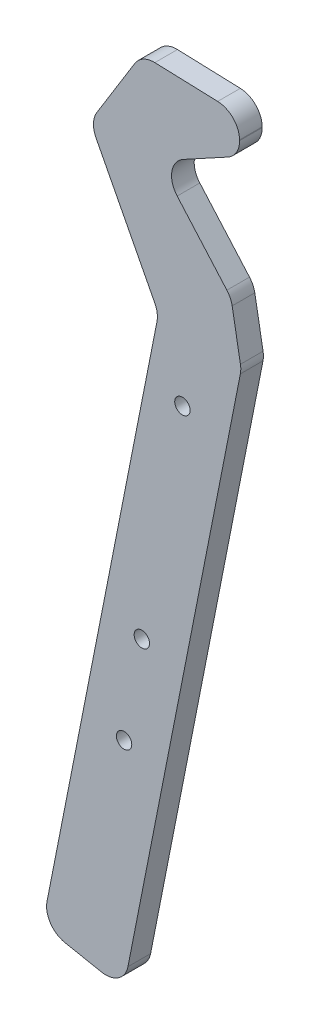
ISO-10303-21;
HEADER;
FILE_DESCRIPTION(('STEP AP214'),'2;1');
FILE_NAME('part.step','',(''),(''),'','','');
FILE_SCHEMA(('AUTOMOTIVE_DESIGN { 1 0 10303 214 1 1 1 1 }'));
ENDSEC;
DATA;
#1=APPLICATION_CONTEXT('core data for automotive mechanical design processes');
#2=APPLICATION_PROTOCOL_DEFINITION('international standard','automotive_design',2000,#1);
#3=PRODUCT_CONTEXT('',#1,'mechanical');
#4=PRODUCT('Part','Part','',(#3));
#5=PRODUCT_RELATED_PRODUCT_CATEGORY('part','',(#4));
#6=PRODUCT_DEFINITION_FORMATION('','',#4);
#7=PRODUCT_DEFINITION_CONTEXT('part definition',#1,'design');
#8=PRODUCT_DEFINITION('design','',#6,#7);
#9=PRODUCT_DEFINITION_SHAPE('','',#8);
#10=(LENGTH_UNIT() NAMED_UNIT(*) SI_UNIT(.MILLI.,.METRE.));
#11=(NAMED_UNIT(*) PLANE_ANGLE_UNIT() SI_UNIT($,.RADIAN.));
#12=(NAMED_UNIT(*) SI_UNIT($,.STERADIAN.) SOLID_ANGLE_UNIT());
#13=UNCERTAINTY_MEASURE_WITH_UNIT(LENGTH_MEASURE(1.E-05),#10,'distance_accuracy_value','');
#14=(GEOMETRIC_REPRESENTATION_CONTEXT(3) GLOBAL_UNCERTAINTY_ASSIGNED_CONTEXT((#13)) GLOBAL_UNIT_ASSIGNED_CONTEXT((#10,
#11,#12)) REPRESENTATION_CONTEXT('',''));
#15=CARTESIAN_POINT('',(0.,0.,0.));
#16=DIRECTION('',(0.,0.,1.));
#17=DIRECTION('',(1.,0.,0.));
#18=AXIS2_PLACEMENT_3D('',#15,#16,#17);
#19=CARTESIAN_POINT('',(-38.8665019834913,-148.048845345949,5.));
#20=DIRECTION('',(0.,0.,1.));
#21=DIRECTION('',(1.,0.,0.));
#22=AXIS2_PLACEMENT_3D('',#19,#20,#21);
#23=PLANE('',#22);
#24=CARTESIAN_POINT('',(-26.7484625073589,-107.729710297534,5.));
#25=DIRECTION('',(0.,0.,1.));
#26=DIRECTION('',(1.,0.,0.));
#27=AXIS2_PLACEMENT_3D('',#24,#25,#26);
#28=CIRCLE('',#27,1.7);
#29=CARTESIAN_POINT('',(-25.0484625073589,-107.729710297534,5.));
#30=VERTEX_POINT('',#29);
#31=EDGE_CURVE('E391',#30,#30,#28,.T.);
#32=ORIENTED_EDGE('',*,*,#31,.F.);
#33=EDGE_LOOP('',(#32));
#34=FACE_BOUND('',#33,.T.);
#35=CARTESIAN_POINT('',(-38.8665019834913,-148.048845345949,5.));
#36=DIRECTION('',(0.,0.,1.));
#37=DIRECTION('',(1.,0.,0.));
#38=AXIS2_PLACEMENT_3D('',#35,#36,#37);
#39=CIRCLE('',#38,4.99999999999981);
#40=CARTESIAN_POINT('',(-43.771872124873,-147.080680186466,5.));
#41=VERTEX_POINT('',#40);
#42=CARTESIAN_POINT('',(-39.8346671429742,-152.954215487331,5.));
#43=VERTEX_POINT('',#42);
#44=EDGE_CURVE('E241',#41,#43,#39,.T.);
#45=ORIENTED_EDGE('',*,*,#44,.T.);
#46=DIRECTION('',(0.981074028276413,-0.193633031896657,0.));
#47=VECTOR('',#46,1.);
#48=CARTESIAN_POINT('',(-39.8346671429742,-152.954215487331,5.));
#49=LINE('',#48,#47);
#50=CARTESIAN_POINT('',(-31.7663230386822,-154.546651823705,5.));
#51=VERTEX_POINT('',#50);
#52=EDGE_CURVE('E129',#43,#51,#49,.T.);
#53=ORIENTED_EDGE('',*,*,#52,.T.);
#54=CARTESIAN_POINT('',(-30.7981578791992,-149.641281682323,5.));
#55=DIRECTION('',(0.,0.,1.));
#56=DIRECTION('',(1.,0.,0.));
#57=AXIS2_PLACEMENT_3D('',#54,#55,#56);
#58=CIRCLE('',#57,5.00000000000011);
#59=CARTESIAN_POINT('',(-25.8927877378168,-150.609446841806,5.));
#60=VERTEX_POINT('',#59);
#61=EDGE_CURVE('E292',#51,#60,#58,.T.);
#62=ORIENTED_EDGE('',*,*,#61,.T.);
#63=DIRECTION('',(0.193633031896657,0.981074028276413,0.));
#64=VECTOR('',#63,1.);
#65=CARTESIAN_POINT('',(-25.8927877378168,-150.609446841806,5.));
#66=LINE('',#65,#64);
#67=CARTESIAN_POINT('',(-1.06250463973813,-24.8026791448716,5.));
#68=VERTEX_POINT('',#67);
#69=EDGE_CURVE('E311',#60,#68,#66,.T.);
#70=ORIENTED_EDGE('',*,*,#69,.T.);
#71=CARTESIAN_POINT('',(-5.96787478112019,-23.8345139853883,5.));
#72=DIRECTION('',(0.,0.,1.));
#73=DIRECTION('',(1.,0.,0.));
#74=AXIS2_PLACEMENT_3D('',#71,#72,#73);
#75=CIRCLE('',#74,5.);
#76=CARTESIAN_POINT('',(-1.04597709465115,-22.9542167833419,5.));
#77=VERTEX_POINT('',#76);
#78=EDGE_CURVE('E308',#68,#77,#75,.T.);
#79=ORIENTED_EDGE('',*,*,#78,.T.);
#80=DIRECTION('',(-0.176059440409267,0.98437953729381,0.));
#81=VECTOR('',#80,1.);
#82=CARTESIAN_POINT('',(-1.04597709465115,-22.9542167833419,5.));
#83=LINE('',#82,#81);
#84=CARTESIAN_POINT('',(-2.87940644662452,-12.7031883070442,5.));
#85=VERTEX_POINT('',#84);
#86=EDGE_CURVE('E310',#77,#85,#83,.T.);
#87=ORIENTED_EDGE('',*,*,#86,.T.);
#88=CARTESIAN_POINT('',(-7.80130413309358,-13.5834855090905,5.));
#89=DIRECTION('',(0.,0.,1.));
#90=DIRECTION('',(1.,0.,0.));
#91=AXIS2_PLACEMENT_3D('',#88,#89,#90);
#92=CIRCLE('',#91,5.);
#93=CARTESIAN_POINT('',(-4.04259850302367,-10.2861938952837,5.));
#94=VERTEX_POINT('',#93);
#95=EDGE_CURVE('E313',#85,#94,#92,.T.);
#96=ORIENTED_EDGE('',*,*,#95,.T.);
#97=DIRECTION('',(-0.65945832276136,0.751741126013985,0.));
#98=VECTOR('',#97,1.);
#99=CARTESIAN_POINT('',(-4.04259850302367,-10.2861938952837,5.));
#100=LINE('',#99,#98);
#101=CARTESIAN_POINT('',(-15.0241596749681,2.23209706542699,5.));
#102=VERTEX_POINT('',#101);
#103=EDGE_CURVE('E319',#94,#102,#100,.T.);
#104=ORIENTED_EDGE('',*,*,#103,.T.);
#105=CARTESIAN_POINT('',(-11.2654540448982,5.52938867923382,5.));
#106=DIRECTION('',(0.,0.,-1.));
#107=DIRECTION('',(-1.,0.,0.));
#108=AXIS2_PLACEMENT_3D('',#105,#106,#107);
#109=CIRCLE('',#108,5.);
#110=CARTESIAN_POINT('',(-13.6608923176584,9.9182240009787,5.));
#111=VERTEX_POINT('',#110);
#112=EDGE_CURVE('E321',#102,#111,#109,.T.);
#113=ORIENTED_EDGE('',*,*,#112,.T.);
#114=DIRECTION('',(0.877767064348971,0.479087654552056,0.));
#115=VECTOR('',#114,1.);
#116=CARTESIAN_POINT('',(-13.6608923176584,9.9182240009787,5.));
#117=LINE('',#116,#115);
#118=CARTESIAN_POINT('',(-3.84489177546762,15.275823833376,5.));
#119=VERTEX_POINT('',#118);
#120=EDGE_CURVE('E323',#111,#119,#117,.T.);
#121=ORIENTED_EDGE('',*,*,#120,.T.);
#122=CARTESIAN_POINT('',(-6.24033004822788,19.6646591551208,5.));
#123=DIRECTION('',(0.,0.,1.));
#124=DIRECTION('',(1.,0.,0.));
#125=AXIS2_PLACEMENT_3D('',#122,#123,#124);
#126=CIRCLE('',#125,5.);
#127=CARTESIAN_POINT('',(-1.24056117125479,19.712733855861,5.));
#128=VERTEX_POINT('',#127);
#129=EDGE_CURVE('E325',#119,#128,#126,.T.);
#130=ORIENTED_EDGE('',*,*,#129,.T.);
#131=DIRECTION('',(-0.00961494014802506,0.999953775394618,0.));
#132=VECTOR('',#131,1.);
#133=CARTESIAN_POINT('',(-1.24056117125479,19.712733855861,5.));
#134=LINE('',#133,#132);
#135=CARTESIAN_POINT('',(-1.24200830417585,19.8632356796507,5.));
#136=VERTEX_POINT('',#135);
#137=EDGE_CURVE('E327',#128,#136,#134,.T.);
#138=ORIENTED_EDGE('',*,*,#137,.T.);
#139=CARTESIAN_POINT('',(-6.24177718114894,19.8151609789106,5.));
#140=DIRECTION('',(0.,0.,1.));
#141=DIRECTION('',(-1.,0.,0.));
#142=AXIS2_PLACEMENT_3D('',#139,#140,#141);
#143=CIRCLE('',#142,5.);
#144=CARTESIAN_POINT('',(-6.07046418155175,24.812225302708,5.));
#145=VERTEX_POINT('',#144);
#146=EDGE_CURVE('E329',#136,#145,#143,.T.);
#147=ORIENTED_EDGE('',*,*,#146,.T.);
#148=DIRECTION('',(-0.999412864759485,0.0342625999194433,0.));
#149=VECTOR('',#148,1.);
#150=CARTESIAN_POINT('',(-6.07046418155175,24.812225302708,5.));
#151=LINE('',#150,#149);
#152=CARTESIAN_POINT('',(-19.9580713536889,25.2883303691481,5.));
#153=VERTEX_POINT('',#152);
#154=EDGE_CURVE('E331',#145,#153,#151,.T.);
#155=ORIENTED_EDGE('',*,*,#154,.T.);
#156=CARTESIAN_POINT('',(-20.1293843532861,20.2912660453506,5.));
#157=DIRECTION('',(0.,0.,1.));
#158=DIRECTION('',(1.,0.,0.));
#159=AXIS2_PLACEMENT_3D('',#156,#157,#158);
#160=CIRCLE('',#159,5.);
#161=CARTESIAN_POINT('',(-24.3841314689178,22.9175042260997,5.));
#162=VERTEX_POINT('',#161);
#163=EDGE_CURVE('E333',#153,#162,#160,.T.);
#164=ORIENTED_EDGE('',*,*,#163,.T.);
#165=DIRECTION('',(-0.525247636149815,-0.850949423126329,0.));
#166=VECTOR('',#165,1.);
#167=CARTESIAN_POINT('',(-24.3841314689178,22.9175042260997,5.));
#168=LINE('',#167,#166);
#169=CARTESIAN_POINT('',(-32.7676694669625,9.33540250454337,5.));
#170=VERTEX_POINT('',#169);
#171=EDGE_CURVE('E335',#162,#170,#168,.T.);
#172=ORIENTED_EDGE('',*,*,#171,.T.);
#173=CARTESIAN_POINT('',(-28.5129223513309,6.70916432379427,5.));
#174=DIRECTION('',(0.,0.,1.));
#175=DIRECTION('',(1.,0.,0.));
#176=AXIS2_PLACEMENT_3D('',#173,#174,#175);
#177=CIRCLE('',#176,5.);
#178=CARTESIAN_POINT('',(-32.9540105671106,4.41204972942542,5.));
#179=VERTEX_POINT('',#178);
#180=EDGE_CURVE('E184',#170,#179,#177,.T.);
#181=ORIENTED_EDGE('',*,*,#180,.T.);
#182=DIRECTION('',(0.459422918873767,-0.888217643155949,0.));
#183=VECTOR('',#182,1.);
#184=CARTESIAN_POINT('',(-32.9540105671106,4.41204972942542,5.));
#185=LINE('',#184,#183);
#186=CARTESIAN_POINT('',(-19.9447834462074,-20.7391227043207,5.));
#187=VERTEX_POINT('',#186);
#188=EDGE_CURVE('E178',#179,#187,#185,.T.);
#189=ORIENTED_EDGE('',*,*,#188,.T.);
#190=CARTESIAN_POINT('',(-24.3858716619871,-23.0362372986896,5.));
#191=DIRECTION('',(0.,0.,-1.));
#192=DIRECTION('',(-1.,0.,0.));
#193=AXIS2_PLACEMENT_3D('',#190,#191,#192);
#194=CIRCLE('',#193,5.);
#195=CARTESIAN_POINT('',(-19.4805015206051,-24.0044024581729,5.));
#196=VERTEX_POINT('',#195);
#197=EDGE_CURVE('E182',#187,#196,#194,.T.);
#198=ORIENTED_EDGE('',*,*,#197,.T.);
#199=DIRECTION('',(-0.193633031896657,-0.981074028276413,0.));
#200=VECTOR('',#199,1.);
#201=CARTESIAN_POINT('',(-19.4805015206051,-24.0044024581729,5.));
#202=LINE('',#201,#200);
#203=EDGE_CURVE('E50',#196,#41,#202,.T.);
#204=ORIENTED_EDGE('',*,*,#203,.T.);
#205=EDGE_LOOP('',(#45,#53,#62,#70,#79,#87,#96,#104,#113,#121,#130,#138,#147,#155,#164,#172,
#181,#189,#198,#204));
#206=FACE_BOUND('',#205,.T.);
#207=CARTESIAN_POINT('',(-13.8653532473741,-37.3573916506778,5.));
#208=DIRECTION('',(0.,0.,1.));
#209=DIRECTION('',(1.,0.,0.));
#210=AXIS2_PLACEMENT_3D('',#207,#208,#209);
#211=CIRCLE('',#210,1.7);
#212=CARTESIAN_POINT('',(-12.1653532473741,-37.3573916506778,5.));
#213=VERTEX_POINT('',#212);
#214=EDGE_CURVE('E206',#213,#213,#211,.T.);
#215=ORIENTED_EDGE('',*,*,#214,.F.);
#216=EDGE_LOOP('',(#215));
#217=FACE_BOUND('',#216,.T.);
#218=CARTESIAN_POINT('',(-22.8255627593025,-86.4125938985046,5.));
#219=DIRECTION('',(0.,0.,1.));
#220=DIRECTION('',(1.,0.,0.));
#221=AXIS2_PLACEMENT_3D('',#218,#219,#220);
#222=CIRCLE('',#221,1.7);
#223=CARTESIAN_POINT('',(-21.1255627593025,-86.4125938985046,5.));
#224=VERTEX_POINT('',#223);
#225=EDGE_CURVE('E382',#224,#224,#222,.T.);
#226=ORIENTED_EDGE('',*,*,#225,.F.);
#227=EDGE_LOOP('',(#226));
#228=FACE_BOUND('',#227,.T.);
#229=ADVANCED_FACE('F33',(#34,#206,#217,#228),#23,.T.);
#230=CARTESIAN_POINT('',(-38.8665019834913,-148.048845345949,0.));
#231=DIRECTION('',(0.,0.,1.));
#232=DIRECTION('',(1.,0.,0.));
#233=AXIS2_PLACEMENT_3D('',#230,#231,#232);
#234=PLANE('',#233);
#235=CARTESIAN_POINT('',(-26.7484625073589,-107.729710297534,0.));
#236=DIRECTION('',(0.,0.,1.));
#237=DIRECTION('',(1.,0.,0.));
#238=AXIS2_PLACEMENT_3D('',#235,#236,#237);
#239=CIRCLE('',#238,1.7);
#240=CARTESIAN_POINT('',(-25.0484625073589,-107.729710297534,0.));
#241=VERTEX_POINT('',#240);
#242=EDGE_CURVE('E388',#241,#241,#239,.T.);
#243=ORIENTED_EDGE('',*,*,#242,.T.);
#244=EDGE_LOOP('',(#243));
#245=FACE_BOUND('',#244,.T.);
#246=CARTESIAN_POINT('',(-38.8665019834913,-148.048845345949,0.));
#247=DIRECTION('',(0.,0.,1.));
#248=DIRECTION('',(1.,0.,0.));
#249=AXIS2_PLACEMENT_3D('',#246,#247,#248);
#250=CIRCLE('',#249,4.99999999999981);
#251=CARTESIAN_POINT('',(-43.771872124873,-147.080680186466,0.));
#252=VERTEX_POINT('',#251);
#253=CARTESIAN_POINT('',(-39.8346671429742,-152.954215487331,0.));
#254=VERTEX_POINT('',#253);
#255=EDGE_CURVE('E202',#252,#254,#250,.T.);
#256=ORIENTED_EDGE('',*,*,#255,.F.);
#257=DIRECTION('',(-0.193633031896657,-0.981074028276413,0.));
#258=VECTOR('',#257,1.);
#259=CARTESIAN_POINT('',(-19.4805015206051,-24.0044024581729,0.));
#260=LINE('',#259,#258);
#261=CARTESIAN_POINT('',(-19.4805015206051,-24.0044024581729,0.));
#262=VERTEX_POINT('',#261);
#263=EDGE_CURVE('E121',#262,#252,#260,.T.);
#264=ORIENTED_EDGE('',*,*,#263,.F.);
#265=CARTESIAN_POINT('',(-24.3858716619871,-23.0362372986896,0.));
#266=DIRECTION('',(0.,0.,-1.));
#267=DIRECTION('',(-1.,0.,0.));
#268=AXIS2_PLACEMENT_3D('',#265,#266,#267);
#269=CIRCLE('',#268,5.);
#270=CARTESIAN_POINT('',(-19.9447834462074,-20.7391227043207,0.));
#271=VERTEX_POINT('',#270);
#272=EDGE_CURVE('E115',#271,#262,#269,.T.);
#273=ORIENTED_EDGE('',*,*,#272,.F.);
#274=DIRECTION('',(0.459422918873767,-0.888217643155949,0.));
#275=VECTOR('',#274,1.);
#276=CARTESIAN_POINT('',(-32.9540105671106,4.41204972942542,0.));
#277=LINE('',#276,#275);
#278=CARTESIAN_POINT('',(-32.9540105671106,4.41204972942542,0.));
#279=VERTEX_POINT('',#278);
#280=EDGE_CURVE('E192',#279,#271,#277,.T.);
#281=ORIENTED_EDGE('',*,*,#280,.F.);
#282=CARTESIAN_POINT('',(-28.5129223513309,6.70916432379427,0.));
#283=DIRECTION('',(0.,0.,1.));
#284=DIRECTION('',(1.,0.,0.));
#285=AXIS2_PLACEMENT_3D('',#282,#283,#284);
#286=CIRCLE('',#285,5.);
#287=CARTESIAN_POINT('',(-32.7676694669625,9.33540250454337,0.));
#288=VERTEX_POINT('',#287);
#289=EDGE_CURVE('E236',#288,#279,#286,.T.);
#290=ORIENTED_EDGE('',*,*,#289,.F.);
#291=DIRECTION('',(-0.525247636149815,-0.850949423126329,0.));
#292=VECTOR('',#291,1.);
#293=CARTESIAN_POINT('',(-24.3841314689178,22.9175042260997,0.));
#294=LINE('',#293,#292);
#295=CARTESIAN_POINT('',(-24.3841314689178,22.9175042260997,0.));
#296=VERTEX_POINT('',#295);
#297=EDGE_CURVE('E234',#296,#288,#294,.T.);
#298=ORIENTED_EDGE('',*,*,#297,.F.);
#299=CARTESIAN_POINT('',(-20.1293843532861,20.2912660453506,0.));
#300=DIRECTION('',(0.,0.,1.));
#301=DIRECTION('',(1.,0.,0.));
#302=AXIS2_PLACEMENT_3D('',#299,#300,#301);
#303=CIRCLE('',#302,5.);
#304=CARTESIAN_POINT('',(-19.9580713536889,25.2883303691481,0.));
#305=VERTEX_POINT('',#304);
#306=EDGE_CURVE('E232',#305,#296,#303,.T.);
#307=ORIENTED_EDGE('',*,*,#306,.F.);
#308=DIRECTION('',(-0.999412864759485,0.0342625999194433,0.));
#309=VECTOR('',#308,1.);
#310=CARTESIAN_POINT('',(-6.07046418155175,24.812225302708,0.));
#311=LINE('',#310,#309);
#312=CARTESIAN_POINT('',(-6.07046418155175,24.812225302708,0.));
#313=VERTEX_POINT('',#312);
#314=EDGE_CURVE('E230',#313,#305,#311,.T.);
#315=ORIENTED_EDGE('',*,*,#314,.F.);
#316=CARTESIAN_POINT('',(-6.24177718114894,19.8151609789106,0.));
#317=DIRECTION('',(0.,0.,1.));
#318=DIRECTION('',(-1.,0.,0.));
#319=AXIS2_PLACEMENT_3D('',#316,#317,#318);
#320=CIRCLE('',#319,5.);
#321=CARTESIAN_POINT('',(-1.24200830417585,19.8632356796507,0.));
#322=VERTEX_POINT('',#321);
#323=EDGE_CURVE('E228',#322,#313,#320,.T.);
#324=ORIENTED_EDGE('',*,*,#323,.F.);
#325=DIRECTION('',(-0.00961494014802506,0.999953775394618,0.));
#326=VECTOR('',#325,1.);
#327=CARTESIAN_POINT('',(-1.24056117125479,19.712733855861,0.));
#328=LINE('',#327,#326);
#329=CARTESIAN_POINT('',(-1.24056117125479,19.712733855861,0.));
#330=VERTEX_POINT('',#329);
#331=EDGE_CURVE('E226',#330,#322,#328,.T.);
#332=ORIENTED_EDGE('',*,*,#331,.F.);
#333=CARTESIAN_POINT('',(-6.24033004822788,19.6646591551208,0.));
#334=DIRECTION('',(0.,0.,1.));
#335=DIRECTION('',(1.,0.,0.));
#336=AXIS2_PLACEMENT_3D('',#333,#334,#335);
#337=CIRCLE('',#336,5.);
#338=CARTESIAN_POINT('',(-3.84489177546762,15.275823833376,0.));
#339=VERTEX_POINT('',#338);
#340=EDGE_CURVE('E224',#339,#330,#337,.T.);
#341=ORIENTED_EDGE('',*,*,#340,.F.);
#342=DIRECTION('',(0.877767064348971,0.479087654552056,0.));
#343=VECTOR('',#342,1.);
#344=CARTESIAN_POINT('',(-13.6608923176584,9.9182240009787,0.));
#345=LINE('',#344,#343);
#346=CARTESIAN_POINT('',(-13.6608923176584,9.9182240009787,0.));
#347=VERTEX_POINT('',#346);
#348=EDGE_CURVE('E222',#347,#339,#345,.T.);
#349=ORIENTED_EDGE('',*,*,#348,.F.);
#350=CARTESIAN_POINT('',(-11.2654540448982,5.52938867923382,0.));
#351=DIRECTION('',(0.,0.,-1.));
#352=DIRECTION('',(-1.,0.,0.));
#353=AXIS2_PLACEMENT_3D('',#350,#351,#352);
#354=CIRCLE('',#353,5.);
#355=CARTESIAN_POINT('',(-15.0241596749681,2.23209706542699,0.));
#356=VERTEX_POINT('',#355);
#357=EDGE_CURVE('E220',#356,#347,#354,.T.);
#358=ORIENTED_EDGE('',*,*,#357,.F.);
#359=DIRECTION('',(-0.65945832276136,0.751741126013985,0.));
#360=VECTOR('',#359,1.);
#361=CARTESIAN_POINT('',(-4.04259850302367,-10.2861938952837,0.));
#362=LINE('',#361,#360);
#363=CARTESIAN_POINT('',(-4.04259850302367,-10.2861938952837,0.));
#364=VERTEX_POINT('',#363);
#365=EDGE_CURVE('E218',#364,#356,#362,.T.);
#366=ORIENTED_EDGE('',*,*,#365,.F.);
#367=CARTESIAN_POINT('',(-7.80130413309358,-13.5834855090905,0.));
#368=DIRECTION('',(0.,0.,1.));
#369=DIRECTION('',(1.,0.,0.));
#370=AXIS2_PLACEMENT_3D('',#367,#368,#369);
#371=CIRCLE('',#370,5.);
#372=CARTESIAN_POINT('',(-2.87940644662452,-12.7031883070442,0.));
#373=VERTEX_POINT('',#372);
#374=EDGE_CURVE('E216',#373,#364,#371,.T.);
#375=ORIENTED_EDGE('',*,*,#374,.F.);
#376=DIRECTION('',(-0.176059440409267,0.98437953729381,0.));
#377=VECTOR('',#376,1.);
#378=CARTESIAN_POINT('',(-1.04597709465115,-22.9542167833419,0.));
#379=LINE('',#378,#377);
#380=CARTESIAN_POINT('',(-1.04597709465115,-22.9542167833419,0.));
#381=VERTEX_POINT('',#380);
#382=EDGE_CURVE('E214',#381,#373,#379,.T.);
#383=ORIENTED_EDGE('',*,*,#382,.F.);
#384=CARTESIAN_POINT('',(-5.96787478112019,-23.8345139853883,0.));
#385=DIRECTION('',(0.,0.,1.));
#386=DIRECTION('',(1.,0.,0.));
#387=AXIS2_PLACEMENT_3D('',#384,#385,#386);
#388=CIRCLE('',#387,5.);
#389=CARTESIAN_POINT('',(-1.06250463973813,-24.8026791448716,0.));
#390=VERTEX_POINT('',#389);
#391=EDGE_CURVE('E212',#390,#381,#388,.T.);
#392=ORIENTED_EDGE('',*,*,#391,.F.);
#393=DIRECTION('',(0.193633031896657,0.981074028276413,0.));
#394=VECTOR('',#393,1.);
#395=CARTESIAN_POINT('',(-25.8927877378168,-150.609446841806,0.));
#396=LINE('',#395,#394);
#397=CARTESIAN_POINT('',(-25.8927877378168,-150.609446841806,0.));
#398=VERTEX_POINT('',#397);
#399=EDGE_CURVE('E210',#398,#390,#396,.T.);
#400=ORIENTED_EDGE('',*,*,#399,.F.);
#401=CARTESIAN_POINT('',(-30.7981578791992,-149.641281682323,0.));
#402=DIRECTION('',(0.,0.,1.));
#403=DIRECTION('',(1.,0.,0.));
#404=AXIS2_PLACEMENT_3D('',#401,#402,#403);
#405=CIRCLE('',#404,5.00000000000011);
#406=CARTESIAN_POINT('',(-31.7663230386822,-154.546651823705,0.));
#407=VERTEX_POINT('',#406);
#408=EDGE_CURVE('E208',#407,#398,#405,.T.);
#409=ORIENTED_EDGE('',*,*,#408,.F.);
#410=DIRECTION('',(0.981074028276413,-0.193633031896657,0.));
#411=VECTOR('',#410,1.);
#412=CARTESIAN_POINT('',(-39.8346671429742,-152.954215487331,0.));
#413=LINE('',#412,#411);
#414=EDGE_CURVE('E205',#254,#407,#413,.T.);
#415=ORIENTED_EDGE('',*,*,#414,.F.);
#416=EDGE_LOOP('',(#256,#264,#273,#281,#290,#298,#307,#315,#324,#332,#341,#349,#358,#366,#375,
#383,#392,#400,#409,#415));
#417=FACE_BOUND('',#416,.T.);
#418=CARTESIAN_POINT('',(-13.8653532473741,-37.3573916506778,0.));
#419=DIRECTION('',(0.,0.,1.));
#420=DIRECTION('',(1.,0.,0.));
#421=AXIS2_PLACEMENT_3D('',#418,#419,#420);
#422=CIRCLE('',#421,1.7);
#423=CARTESIAN_POINT('',(-12.1653532473741,-37.3573916506778,0.));
#424=VERTEX_POINT('',#423);
#425=EDGE_CURVE('E394',#424,#424,#422,.T.);
#426=ORIENTED_EDGE('',*,*,#425,.T.);
#427=EDGE_LOOP('',(#426));
#428=FACE_BOUND('',#427,.T.);
#429=CARTESIAN_POINT('',(-22.8255627593025,-86.4125938985046,0.));
#430=DIRECTION('',(0.,0.,1.));
#431=DIRECTION('',(1.,0.,0.));
#432=AXIS2_PLACEMENT_3D('',#429,#430,#431);
#433=CIRCLE('',#432,1.7);
#434=CARTESIAN_POINT('',(-21.1255627593025,-86.4125938985046,0.));
#435=VERTEX_POINT('',#434);
#436=EDGE_CURVE('E385',#435,#435,#433,.T.);
#437=ORIENTED_EDGE('',*,*,#436,.T.);
#438=EDGE_LOOP('',(#437));
#439=FACE_BOUND('',#438,.T.);
#440=ADVANCED_FACE('F296',(#245,#417,#428,#439),#234,.F.);
#441=CARTESIAN_POINT('',(-38.8665019834913,-148.048845345949,5.));
#442=DIRECTION('',(0.,0.,-1.));
#443=DIRECTION('',(-1.,0.,0.));
#444=AXIS2_PLACEMENT_3D('',#441,#442,#443);
#445=CYLINDRICAL_SURFACE('',#444,4.99999999999981);
#446=ORIENTED_EDGE('',*,*,#255,.T.);
#447=DIRECTION('',(0.,0.,-1.));
#448=VECTOR('',#447,1.);
#449=CARTESIAN_POINT('',(-39.8346671429742,-152.954215487331,5.));
#450=LINE('',#449,#448);
#451=EDGE_CURVE('E11',#43,#254,#450,.T.);
#452=ORIENTED_EDGE('',*,*,#451,.F.);
#453=ORIENTED_EDGE('',*,*,#44,.F.);
#454=DIRECTION('',(0.,0.,-1.));
#455=VECTOR('',#454,1.);
#456=CARTESIAN_POINT('',(-43.771872124873,-147.080680186466,5.));
#457=LINE('',#456,#455);
#458=EDGE_CURVE('E198',#41,#252,#457,.T.);
#459=ORIENTED_EDGE('',*,*,#458,.T.);
#460=EDGE_LOOP('',(#446,#452,#453,#459));
#461=FACE_BOUND('',#460,.T.);
#462=ADVANCED_FACE('F35',(#461),#445,.T.);
#463=CARTESIAN_POINT('',(-39.8346671429742,-152.954215487331,5.));
#464=DIRECTION('',(0.193633031896657,0.981074028276413,0.));
#465=DIRECTION('',(-0.981074028276413,0.193633031896657,0.));
#466=AXIS2_PLACEMENT_3D('',#463,#464,#465);
#467=PLANE('',#466);
#468=ORIENTED_EDGE('',*,*,#414,.T.);
#469=DIRECTION('',(0.,0.,-1.));
#470=VECTOR('',#469,1.);
#471=CARTESIAN_POINT('',(-31.7663230386822,-154.546651823705,5.));
#472=LINE('',#471,#470);
#473=EDGE_CURVE('E42',#51,#407,#472,.T.);
#474=ORIENTED_EDGE('',*,*,#473,.F.);
#475=ORIENTED_EDGE('',*,*,#52,.F.);
#476=ORIENTED_EDGE('',*,*,#451,.T.);
#477=EDGE_LOOP('',(#468,#474,#475,#476));
#478=FACE_BOUND('',#477,.T.);
#479=ADVANCED_FACE('F575',(#478),#467,.F.);
#480=CARTESIAN_POINT('',(-30.7981578791992,-149.641281682323,5.));
#481=DIRECTION('',(0.,0.,-1.));
#482=DIRECTION('',(-1.,0.,0.));
#483=AXIS2_PLACEMENT_3D('',#480,#481,#482);
#484=CYLINDRICAL_SURFACE('',#483,5.00000000000011);
#485=ORIENTED_EDGE('',*,*,#408,.T.);
#486=DIRECTION('',(0.,0.,-1.));
#487=VECTOR('',#486,1.);
#488=CARTESIAN_POINT('',(-25.8927877378168,-150.609446841806,5.));
#489=LINE('',#488,#487);
#490=EDGE_CURVE('E284',#60,#398,#489,.T.);
#491=ORIENTED_EDGE('',*,*,#490,.F.);
#492=ORIENTED_EDGE('',*,*,#61,.F.);
#493=ORIENTED_EDGE('',*,*,#473,.T.);
#494=EDGE_LOOP('',(#485,#491,#492,#493));
#495=FACE_BOUND('',#494,.T.);
#496=ADVANCED_FACE('F290',(#495),#484,.T.);
#497=CARTESIAN_POINT('',(-25.8927877378168,-150.609446841806,5.));
#498=DIRECTION('',(-0.981074028276413,0.193633031896657,0.));
#499=DIRECTION('',(-0.193633031896657,-0.981074028276413,0.));
#500=AXIS2_PLACEMENT_3D('',#497,#498,#499);
#501=PLANE('',#500);
#502=ORIENTED_EDGE('',*,*,#399,.T.);
#503=DIRECTION('',(0.,0.,-1.));
#504=VECTOR('',#503,1.);
#505=CARTESIAN_POINT('',(-1.06250463973813,-24.8026791448716,5.));
#506=LINE('',#505,#504);
#507=EDGE_CURVE('E281',#68,#390,#506,.T.);
#508=ORIENTED_EDGE('',*,*,#507,.F.);
#509=ORIENTED_EDGE('',*,*,#69,.F.);
#510=ORIENTED_EDGE('',*,*,#490,.T.);
#511=EDGE_LOOP('',(#502,#508,#509,#510));
#512=FACE_BOUND('',#511,.T.);
#513=ADVANCED_FACE('F302',(#512),#501,.F.);
#514=CARTESIAN_POINT('',(-5.96787478112019,-23.8345139853883,5.));
#515=DIRECTION('',(0.,0.,-1.));
#516=DIRECTION('',(-1.,0.,0.));
#517=AXIS2_PLACEMENT_3D('',#514,#515,#516);
#518=CYLINDRICAL_SURFACE('',#517,5.);
#519=ORIENTED_EDGE('',*,*,#391,.T.);
#520=DIRECTION('',(0.,0.,-1.));
#521=VECTOR('',#520,1.);
#522=CARTESIAN_POINT('',(-1.04597709465115,-22.9542167833419,5.));
#523=LINE('',#522,#521);
#524=EDGE_CURVE('E278',#77,#381,#523,.T.);
#525=ORIENTED_EDGE('',*,*,#524,.F.);
#526=ORIENTED_EDGE('',*,*,#78,.F.);
#527=ORIENTED_EDGE('',*,*,#507,.T.);
#528=EDGE_LOOP('',(#519,#525,#526,#527));
#529=FACE_BOUND('',#528,.T.);
#530=ADVANCED_FACE('F306',(#529),#518,.T.);
#531=CARTESIAN_POINT('',(-1.04597709465115,-22.9542167833419,5.));
#532=DIRECTION('',(-0.98437953729381,-0.176059440409267,0.));
#533=DIRECTION('',(0.176059440409267,-0.98437953729381,0.));
#534=AXIS2_PLACEMENT_3D('',#531,#532,#533);
#535=PLANE('',#534);
#536=ORIENTED_EDGE('',*,*,#382,.T.);
#537=DIRECTION('',(0.,0.,-1.));
#538=VECTOR('',#537,1.);
#539=CARTESIAN_POINT('',(-2.87940644662452,-12.7031883070442,5.));
#540=LINE('',#539,#538);
#541=EDGE_CURVE('E275',#85,#373,#540,.T.);
#542=ORIENTED_EDGE('',*,*,#541,.F.);
#543=ORIENTED_EDGE('',*,*,#86,.F.);
#544=ORIENTED_EDGE('',*,*,#524,.T.);
#545=EDGE_LOOP('',(#536,#542,#543,#544));
#546=FACE_BOUND('',#545,.T.);
#547=ADVANCED_FACE('F540',(#546),#535,.F.);
#548=CARTESIAN_POINT('',(-7.80130413309358,-13.5834855090905,5.));
#549=DIRECTION('',(0.,0.,-1.));
#550=DIRECTION('',(-1.,0.,0.));
#551=AXIS2_PLACEMENT_3D('',#548,#549,#550);
#552=CYLINDRICAL_SURFACE('',#551,5.);
#553=ORIENTED_EDGE('',*,*,#374,.T.);
#554=DIRECTION('',(0.,0.,-1.));
#555=VECTOR('',#554,1.);
#556=CARTESIAN_POINT('',(-4.04259850302367,-10.2861938952837,5.));
#557=LINE('',#556,#555);
#558=EDGE_CURVE('E272',#94,#364,#557,.T.);
#559=ORIENTED_EDGE('',*,*,#558,.F.);
#560=ORIENTED_EDGE('',*,*,#95,.F.);
#561=ORIENTED_EDGE('',*,*,#541,.T.);
#562=EDGE_LOOP('',(#553,#559,#560,#561));
#563=FACE_BOUND('',#562,.T.);
#564=ADVANCED_FACE('F530',(#563),#552,.T.);
#565=CARTESIAN_POINT('',(-4.04259850302367,-10.2861938952837,5.));
#566=DIRECTION('',(-0.751741126013985,-0.65945832276136,0.));
#567=DIRECTION('',(0.65945832276136,-0.751741126013985,0.));
#568=AXIS2_PLACEMENT_3D('',#565,#566,#567);
#569=PLANE('',#568);
#570=ORIENTED_EDGE('',*,*,#365,.T.);
#571=DIRECTION('',(0.,0.,-1.));
#572=VECTOR('',#571,1.);
#573=CARTESIAN_POINT('',(-15.0241596749681,2.23209706542699,5.));
#574=LINE('',#573,#572);
#575=EDGE_CURVE('E269',#102,#356,#574,.T.);
#576=ORIENTED_EDGE('',*,*,#575,.F.);
#577=ORIENTED_EDGE('',*,*,#103,.F.);
#578=ORIENTED_EDGE('',*,*,#558,.T.);
#579=EDGE_LOOP('',(#570,#576,#577,#578));
#580=FACE_BOUND('',#579,.T.);
#581=ADVANCED_FACE('F520',(#580),#569,.F.);
#582=CARTESIAN_POINT('',(-11.2654540448982,5.52938867923382,5.));
#583=DIRECTION('',(0.,0.,-1.));
#584=DIRECTION('',(-1.,0.,0.));
#585=AXIS2_PLACEMENT_3D('',#582,#583,#584);
#586=CYLINDRICAL_SURFACE('',#585,5.);
#587=ORIENTED_EDGE('',*,*,#357,.T.);
#588=DIRECTION('',(0.,0.,-1.));
#589=VECTOR('',#588,1.);
#590=CARTESIAN_POINT('',(-13.6608923176584,9.9182240009787,5.));
#591=LINE('',#590,#589);
#592=EDGE_CURVE('E266',#111,#347,#591,.T.);
#593=ORIENTED_EDGE('',*,*,#592,.F.);
#594=ORIENTED_EDGE('',*,*,#112,.F.);
#595=ORIENTED_EDGE('',*,*,#575,.T.);
#596=EDGE_LOOP('',(#587,#593,#594,#595));
#597=FACE_BOUND('',#596,.T.);
#598=ADVANCED_FACE('F510',(#597),#586,.F.);
#599=CARTESIAN_POINT('',(-13.6608923176584,9.9182240009787,5.));
#600=DIRECTION('',(-0.479087654552056,0.877767064348971,0.));
#601=DIRECTION('',(-0.877767064348971,-0.479087654552056,0.));
#602=AXIS2_PLACEMENT_3D('',#599,#600,#601);
#603=PLANE('',#602);
#604=ORIENTED_EDGE('',*,*,#348,.T.);
#605=DIRECTION('',(0.,0.,-1.));
#606=VECTOR('',#605,1.);
#607=CARTESIAN_POINT('',(-3.84489177546762,15.275823833376,5.));
#608=LINE('',#607,#606);
#609=EDGE_CURVE('E263',#119,#339,#608,.T.);
#610=ORIENTED_EDGE('',*,*,#609,.F.);
#611=ORIENTED_EDGE('',*,*,#120,.F.);
#612=ORIENTED_EDGE('',*,*,#592,.T.);
#613=EDGE_LOOP('',(#604,#610,#611,#612));
#614=FACE_BOUND('',#613,.T.);
#615=ADVANCED_FACE('F500',(#614),#603,.F.);
#616=CARTESIAN_POINT('',(-6.24033004822788,19.6646591551208,5.));
#617=DIRECTION('',(0.,0.,-1.));
#618=DIRECTION('',(-1.,0.,0.));
#619=AXIS2_PLACEMENT_3D('',#616,#617,#618);
#620=CYLINDRICAL_SURFACE('',#619,5.);
#621=ORIENTED_EDGE('',*,*,#340,.T.);
#622=DIRECTION('',(0.,0.,-1.));
#623=VECTOR('',#622,1.);
#624=CARTESIAN_POINT('',(-1.24056117125479,19.712733855861,5.));
#625=LINE('',#624,#623);
#626=EDGE_CURVE('E260',#128,#330,#625,.T.);
#627=ORIENTED_EDGE('',*,*,#626,.F.);
#628=ORIENTED_EDGE('',*,*,#129,.F.);
#629=ORIENTED_EDGE('',*,*,#609,.T.);
#630=EDGE_LOOP('',(#621,#627,#628,#629));
#631=FACE_BOUND('',#630,.T.);
#632=ADVANCED_FACE('F490',(#631),#620,.T.);
#633=CARTESIAN_POINT('',(-1.24056117125479,19.712733855861,5.));
#634=DIRECTION('',(-0.999953775394618,-0.00961494014802506,0.));
#635=DIRECTION('',(0.00961494014802506,-0.999953775394618,0.));
#636=AXIS2_PLACEMENT_3D('',#633,#634,#635);
#637=PLANE('',#636);
#638=ORIENTED_EDGE('',*,*,#331,.T.);
#639=DIRECTION('',(0.,0.,-1.));
#640=VECTOR('',#639,1.);
#641=CARTESIAN_POINT('',(-1.24200830417585,19.8632356796507,5.));
#642=LINE('',#641,#640);
#643=EDGE_CURVE('E257',#136,#322,#642,.T.);
#644=ORIENTED_EDGE('',*,*,#643,.F.);
#645=ORIENTED_EDGE('',*,*,#137,.F.);
#646=ORIENTED_EDGE('',*,*,#626,.T.);
#647=EDGE_LOOP('',(#638,#644,#645,#646));
#648=FACE_BOUND('',#647,.T.);
#649=ADVANCED_FACE('F480',(#648),#637,.F.);
#650=CARTESIAN_POINT('',(-6.24177718114894,19.8151609789106,5.));
#651=DIRECTION('',(0.,0.,-1.));
#652=DIRECTION('',(-1.,0.,0.));
#653=AXIS2_PLACEMENT_3D('',#650,#651,#652);
#654=CYLINDRICAL_SURFACE('',#653,5.);
#655=ORIENTED_EDGE('',*,*,#323,.T.);
#656=DIRECTION('',(0.,0.,-1.));
#657=VECTOR('',#656,1.);
#658=CARTESIAN_POINT('',(-6.07046418155175,24.812225302708,5.));
#659=LINE('',#658,#657);
#660=EDGE_CURVE('E254',#145,#313,#659,.T.);
#661=ORIENTED_EDGE('',*,*,#660,.F.);
#662=ORIENTED_EDGE('',*,*,#146,.F.);
#663=ORIENTED_EDGE('',*,*,#643,.T.);
#664=EDGE_LOOP('',(#655,#661,#662,#663));
#665=FACE_BOUND('',#664,.T.);
#666=ADVANCED_FACE('F470',(#665),#654,.T.);
#667=CARTESIAN_POINT('',(-6.07046418155175,24.812225302708,5.));
#668=DIRECTION('',(-0.0342625999194433,-0.999412864759485,0.));
#669=DIRECTION('',(0.999412864759485,-0.0342625999194433,0.));
#670=AXIS2_PLACEMENT_3D('',#667,#668,#669);
#671=PLANE('',#670);
#672=ORIENTED_EDGE('',*,*,#314,.T.);
#673=DIRECTION('',(0.,0.,-1.));
#674=VECTOR('',#673,1.);
#675=CARTESIAN_POINT('',(-19.9580713536889,25.2883303691481,5.));
#676=LINE('',#675,#674);
#677=EDGE_CURVE('E251',#153,#305,#676,.T.);
#678=ORIENTED_EDGE('',*,*,#677,.F.);
#679=ORIENTED_EDGE('',*,*,#154,.F.);
#680=ORIENTED_EDGE('',*,*,#660,.T.);
#681=EDGE_LOOP('',(#672,#678,#679,#680));
#682=FACE_BOUND('',#681,.T.);
#683=ADVANCED_FACE('F460',(#682),#671,.F.);
#684=CARTESIAN_POINT('',(-20.1293843532861,20.2912660453506,5.));
#685=DIRECTION('',(0.,0.,-1.));
#686=DIRECTION('',(-1.,0.,0.));
#687=AXIS2_PLACEMENT_3D('',#684,#685,#686);
#688=CYLINDRICAL_SURFACE('',#687,5.);
#689=ORIENTED_EDGE('',*,*,#306,.T.);
#690=DIRECTION('',(0.,0.,-1.));
#691=VECTOR('',#690,1.);
#692=CARTESIAN_POINT('',(-24.3841314689178,22.9175042260997,5.));
#693=LINE('',#692,#691);
#694=EDGE_CURVE('E248',#162,#296,#693,.T.);
#695=ORIENTED_EDGE('',*,*,#694,.F.);
#696=ORIENTED_EDGE('',*,*,#163,.F.);
#697=ORIENTED_EDGE('',*,*,#677,.T.);
#698=EDGE_LOOP('',(#689,#695,#696,#697));
#699=FACE_BOUND('',#698,.T.);
#700=ADVANCED_FACE('F451',(#699),#688,.T.);
#701=CARTESIAN_POINT('',(-24.3841314689178,22.9175042260997,5.));
#702=DIRECTION('',(0.850949423126329,-0.525247636149815,0.));
#703=DIRECTION('',(0.525247636149815,0.850949423126329,0.));
#704=AXIS2_PLACEMENT_3D('',#701,#702,#703);
#705=PLANE('',#704);
#706=ORIENTED_EDGE('',*,*,#297,.T.);
#707=DIRECTION('',(0.,0.,-1.));
#708=VECTOR('',#707,1.);
#709=CARTESIAN_POINT('',(-32.7676694669625,9.33540250454337,5.));
#710=LINE('',#709,#708);
#711=EDGE_CURVE('E245',#170,#288,#710,.T.);
#712=ORIENTED_EDGE('',*,*,#711,.F.);
#713=ORIENTED_EDGE('',*,*,#171,.F.);
#714=ORIENTED_EDGE('',*,*,#694,.T.);
#715=EDGE_LOOP('',(#706,#712,#713,#714));
#716=FACE_BOUND('',#715,.T.);
#717=ADVANCED_FACE('F341',(#716),#705,.F.);
#718=CARTESIAN_POINT('',(-28.5129223513309,6.70916432379427,5.));
#719=DIRECTION('',(0.,0.,-1.));
#720=DIRECTION('',(-1.,0.,0.));
#721=AXIS2_PLACEMENT_3D('',#718,#719,#720);
#722=CYLINDRICAL_SURFACE('',#721,5.);
#723=ORIENTED_EDGE('',*,*,#289,.T.);
#724=DIRECTION('',(0.,0.,-1.));
#725=VECTOR('',#724,1.);
#726=CARTESIAN_POINT('',(-32.9540105671106,4.41204972942542,5.));
#727=LINE('',#726,#725);
#728=EDGE_CURVE('E193',#179,#279,#727,.T.);
#729=ORIENTED_EDGE('',*,*,#728,.F.);
#730=ORIENTED_EDGE('',*,*,#180,.F.);
#731=ORIENTED_EDGE('',*,*,#711,.T.);
#732=EDGE_LOOP('',(#723,#729,#730,#731));
#733=FACE_BOUND('',#732,.T.);
#734=ADVANCED_FACE('F345',(#733),#722,.T.);
#735=CARTESIAN_POINT('',(-32.9540105671106,4.41204972942542,5.));
#736=DIRECTION('',(0.888217643155949,0.459422918873767,0.));
#737=DIRECTION('',(-0.459422918873767,0.888217643155949,0.));
#738=AXIS2_PLACEMENT_3D('',#735,#736,#737);
#739=PLANE('',#738);
#740=ORIENTED_EDGE('',*,*,#280,.T.);
#741=DIRECTION('',(0.,0.,-1.));
#742=VECTOR('',#741,1.);
#743=CARTESIAN_POINT('',(-19.9447834462074,-20.7391227043207,5.));
#744=LINE('',#743,#742);
#745=EDGE_CURVE('E189',#187,#271,#744,.T.);
#746=ORIENTED_EDGE('',*,*,#745,.F.);
#747=ORIENTED_EDGE('',*,*,#188,.F.);
#748=ORIENTED_EDGE('',*,*,#728,.T.);
#749=EDGE_LOOP('',(#740,#746,#747,#748));
#750=FACE_BOUND('',#749,.T.);
#751=ADVANCED_FACE('F190',(#750),#739,.F.);
#752=CARTESIAN_POINT('',(-24.3858716619871,-23.0362372986896,5.));
#753=DIRECTION('',(0.,0.,-1.));
#754=DIRECTION('',(-1.,0.,0.));
#755=AXIS2_PLACEMENT_3D('',#752,#753,#754);
#756=CYLINDRICAL_SURFACE('',#755,5.);
#757=ORIENTED_EDGE('',*,*,#272,.T.);
#758=DIRECTION('',(0.,0.,-1.));
#759=VECTOR('',#758,1.);
#760=CARTESIAN_POINT('',(-19.4805015206051,-24.0044024581729,5.));
#761=LINE('',#760,#759);
#762=EDGE_CURVE('E194',#196,#262,#761,.T.);
#763=ORIENTED_EDGE('',*,*,#762,.F.);
#764=ORIENTED_EDGE('',*,*,#197,.F.);
#765=ORIENTED_EDGE('',*,*,#745,.T.);
#766=EDGE_LOOP('',(#757,#763,#764,#765));
#767=FACE_BOUND('',#766,.T.);
#768=ADVANCED_FACE('F196',(#767),#756,.F.);
#769=CARTESIAN_POINT('',(-19.4805015206051,-24.0044024581729,5.));
#770=DIRECTION('',(0.981074028276413,-0.193633031896657,0.));
#771=DIRECTION('',(0.193633031896657,0.981074028276413,0.));
#772=AXIS2_PLACEMENT_3D('',#769,#770,#771);
#773=PLANE('',#772);
#774=ORIENTED_EDGE('',*,*,#263,.T.);
#775=ORIENTED_EDGE('',*,*,#458,.F.);
#776=ORIENTED_EDGE('',*,*,#203,.F.);
#777=ORIENTED_EDGE('',*,*,#762,.T.);
#778=EDGE_LOOP('',(#774,#775,#776,#777));
#779=FACE_BOUND('',#778,.T.);
#780=ADVANCED_FACE('F349',(#779),#773,.F.);
#781=CARTESIAN_POINT('',(-13.8653532473741,-37.3573916506778,5.));
#782=DIRECTION('',(0.,0.,-1.));
#783=DIRECTION('',(-1.,0.,0.));
#784=AXIS2_PLACEMENT_3D('',#781,#782,#783);
#785=CYLINDRICAL_SURFACE('',#784,1.7);
#786=ORIENTED_EDGE('',*,*,#214,.T.);
#787=EDGE_LOOP('',(#786));
#788=FACE_BOUND('',#787,.T.);
#789=ORIENTED_EDGE('',*,*,#425,.F.);
#790=EDGE_LOOP('',(#789));
#791=FACE_BOUND('',#790,.T.);
#792=ADVANCED_FACE('F351',(#788,#791),#785,.F.);
#793=CARTESIAN_POINT('',(-26.7484625073589,-107.729710297534,5.));
#794=DIRECTION('',(0.,0.,-1.));
#795=DIRECTION('',(-1.,0.,0.));
#796=AXIS2_PLACEMENT_3D('',#793,#794,#795);
#797=CYLINDRICAL_SURFACE('',#796,1.7);
#798=ORIENTED_EDGE('',*,*,#31,.T.);
#799=EDGE_LOOP('',(#798));
#800=FACE_BOUND('',#799,.T.);
#801=ORIENTED_EDGE('',*,*,#242,.F.);
#802=EDGE_LOOP('',(#801));
#803=FACE_BOUND('',#802,.T.);
#804=ADVANCED_FACE('F357',(#800,#803),#797,.F.);
#805=CARTESIAN_POINT('',(-22.8255627593025,-86.4125938985046,5.));
#806=DIRECTION('',(0.,0.,-1.));
#807=DIRECTION('',(-1.,0.,0.));
#808=AXIS2_PLACEMENT_3D('',#805,#806,#807);
#809=CYLINDRICAL_SURFACE('',#808,1.7);
#810=ORIENTED_EDGE('',*,*,#225,.T.);
#811=EDGE_LOOP('',(#810));
#812=FACE_BOUND('',#811,.T.);
#813=ORIENTED_EDGE('',*,*,#436,.F.);
#814=EDGE_LOOP('',(#813));
#815=FACE_BOUND('',#814,.T.);
#816=ADVANCED_FACE('F373',(#812,#815),#809,.F.);
#817=CLOSED_SHELL('',(#229,#440,#462,#479,#496,#513,#530,#547,#564,#581,#598,#615,#632,#649,
#666,#683,#700,#717,#734,#751,#768,#780,#792,#804,#816));
#818=MANIFOLD_SOLID_BREP('B2',#817);
#819=ADVANCED_BREP_SHAPE_REPRESENTATION('',(#18,#818),#14);
#820=SHAPE_DEFINITION_REPRESENTATION(#9,#819);
ENDSEC;
END-ISO-10303-21;
